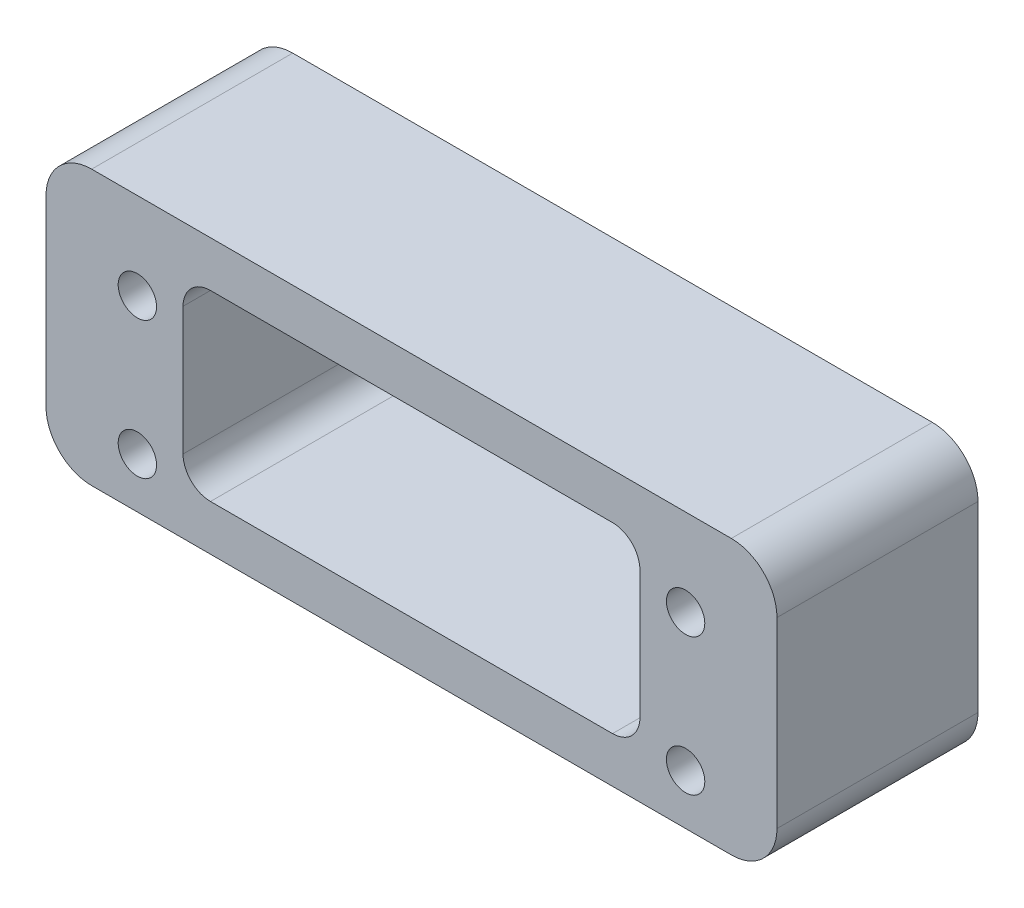
ISO-10303-21;
HEADER;
FILE_DESCRIPTION(('STEP AP214'),'2;1');
FILE_NAME('part.step','',(''),(''),'','','');
FILE_SCHEMA(('AUTOMOTIVE_DESIGN { 1 0 10303 214 1 1 1 1 }'));
ENDSEC;
DATA;
#1=APPLICATION_CONTEXT('core data for automotive mechanical design processes');
#2=APPLICATION_PROTOCOL_DEFINITION('international standard','automotive_design',2000,#1);
#3=PRODUCT_CONTEXT('',#1,'mechanical');
#4=PRODUCT('Part','Part','',(#3));
#5=PRODUCT_RELATED_PRODUCT_CATEGORY('part','',(#4));
#6=PRODUCT_DEFINITION_FORMATION('','',#4);
#7=PRODUCT_DEFINITION_CONTEXT('part definition',#1,'design');
#8=PRODUCT_DEFINITION('design','',#6,#7);
#9=PRODUCT_DEFINITION_SHAPE('','',#8);
#10=(LENGTH_UNIT() NAMED_UNIT(*) SI_UNIT(.MILLI.,.METRE.));
#11=(NAMED_UNIT(*) PLANE_ANGLE_UNIT() SI_UNIT($,.RADIAN.));
#12=(NAMED_UNIT(*) SI_UNIT($,.STERADIAN.) SOLID_ANGLE_UNIT());
#13=UNCERTAINTY_MEASURE_WITH_UNIT(LENGTH_MEASURE(1.E-05),#10,'distance_accuracy_value','');
#14=(GEOMETRIC_REPRESENTATION_CONTEXT(3) GLOBAL_UNCERTAINTY_ASSIGNED_CONTEXT((#13)) GLOBAL_UNIT_ASSIGNED_CONTEXT((#10,
#11,#12)) REPRESENTATION_CONTEXT('',''));
#15=CARTESIAN_POINT('',(0.,0.,0.));
#16=DIRECTION('',(0.,0.,1.));
#17=DIRECTION('',(1.,0.,0.));
#18=AXIS2_PLACEMENT_3D('',#15,#16,#17);
#19=CARTESIAN_POINT('',(40.,15.,11.));
#20=DIRECTION('',(-1.,0.,0.));
#21=DIRECTION('',(0.,-1.,0.));
#22=AXIS2_PLACEMENT_3D('',#19,#20,#21);
#23=PLANE('',#22);
#24=DIRECTION('',(0.,1.,0.));
#25=VECTOR('',#24,1.);
#26=CARTESIAN_POINT('',(40.,15.,11.));
#27=LINE('',#26,#25);
#28=CARTESIAN_POINT('',(40.,-10.,11.));
#29=VERTEX_POINT('',#28);
#30=CARTESIAN_POINT('',(40.,9.99999999999999,11.));
#31=VERTEX_POINT('',#30);
#32=EDGE_CURVE('E168',#29,#31,#27,.T.);
#33=ORIENTED_EDGE('',*,*,#32,.F.);
#34=DIRECTION('',(0.,0.,-1.));
#35=VECTOR('',#34,1.);
#36=CARTESIAN_POINT('',(40.,-10.,11.));
#37=LINE('',#36,#35);
#38=CARTESIAN_POINT('',(40.,-10.,-11.));
#39=VERTEX_POINT('',#38);
#40=EDGE_CURVE('E153',#29,#39,#37,.T.);
#41=ORIENTED_EDGE('',*,*,#40,.T.);
#42=DIRECTION('',(0.,1.,0.));
#43=VECTOR('',#42,1.);
#44=CARTESIAN_POINT('',(40.,15.,-11.));
#45=LINE('',#44,#43);
#46=CARTESIAN_POINT('',(40.,9.99999999999999,-11.));
#47=VERTEX_POINT('',#46);
#48=EDGE_CURVE('E165',#39,#47,#45,.T.);
#49=ORIENTED_EDGE('',*,*,#48,.T.);
#50=DIRECTION('',(0.,0.,-1.));
#51=VECTOR('',#50,1.);
#52=CARTESIAN_POINT('',(40.,9.99999999999999,11.));
#53=LINE('',#52,#51);
#54=EDGE_CURVE('E170',#47,#31,#53,.F.);
#55=ORIENTED_EDGE('',*,*,#54,.T.);
#56=EDGE_LOOP('',(#33,#41,#49,#55));
#57=FACE_BOUND('',#56,.T.);
#58=ADVANCED_FACE('F36',(#57),#23,.F.);
#59=CARTESIAN_POINT('',(-40.,15.,11.));
#60=DIRECTION('',(0.,-1.,0.));
#61=DIRECTION('',(1.,0.,0.));
#62=AXIS2_PLACEMENT_3D('',#59,#60,#61);
#63=PLANE('',#62);
#64=DIRECTION('',(-1.,0.,0.));
#65=VECTOR('',#64,1.);
#66=CARTESIAN_POINT('',(-40.,15.,-11.));
#67=LINE('',#66,#65);
#68=CARTESIAN_POINT('',(35.,15.,-11.));
#69=VERTEX_POINT('',#68);
#70=CARTESIAN_POINT('',(-35.,15.,-11.));
#71=VERTEX_POINT('',#70);
#72=EDGE_CURVE('E174',#69,#71,#67,.T.);
#73=ORIENTED_EDGE('',*,*,#72,.T.);
#74=DIRECTION('',(0.,0.,-1.));
#75=VECTOR('',#74,1.);
#76=CARTESIAN_POINT('',(-35.,15.,11.));
#77=LINE('',#76,#75);
#78=CARTESIAN_POINT('',(-35.,15.,11.));
#79=VERTEX_POINT('',#78);
#80=EDGE_CURVE('E215',#71,#79,#77,.F.);
#81=ORIENTED_EDGE('',*,*,#80,.T.);
#82=DIRECTION('',(-1.,0.,0.));
#83=VECTOR('',#82,1.);
#84=CARTESIAN_POINT('',(-40.,15.,11.));
#85=LINE('',#84,#83);
#86=CARTESIAN_POINT('',(35.,15.,11.));
#87=VERTEX_POINT('',#86);
#88=EDGE_CURVE('E290',#87,#79,#85,.T.);
#89=ORIENTED_EDGE('',*,*,#88,.F.);
#90=DIRECTION('',(0.,0.,-1.));
#91=VECTOR('',#90,1.);
#92=CARTESIAN_POINT('',(35.,15.,11.));
#93=LINE('',#92,#91);
#94=EDGE_CURVE('E212',#87,#69,#93,.T.);
#95=ORIENTED_EDGE('',*,*,#94,.T.);
#96=EDGE_LOOP('',(#73,#81,#89,#95));
#97=FACE_BOUND('',#96,.T.);
#98=ADVANCED_FACE('F314',(#97),#63,.F.);
#99=CARTESIAN_POINT('',(-40.,15.,11.));
#100=DIRECTION('',(1.,0.,0.));
#101=DIRECTION('',(0.,1.,0.));
#102=AXIS2_PLACEMENT_3D('',#99,#100,#101);
#103=PLANE('',#102);
#104=DIRECTION('',(0.,-1.,0.));
#105=VECTOR('',#104,1.);
#106=CARTESIAN_POINT('',(-40.,15.,-11.));
#107=LINE('',#106,#105);
#108=CARTESIAN_POINT('',(-40.,9.99999999999999,-11.));
#109=VERTEX_POINT('',#108);
#110=CARTESIAN_POINT('',(-40.,-10.,-11.));
#111=VERTEX_POINT('',#110);
#112=EDGE_CURVE('E178',#109,#111,#107,.T.);
#113=ORIENTED_EDGE('',*,*,#112,.T.);
#114=DIRECTION('',(0.,0.,-1.));
#115=VECTOR('',#114,1.);
#116=CARTESIAN_POINT('',(-40.,-10.,11.));
#117=LINE('',#116,#115);
#118=CARTESIAN_POINT('',(-40.,-10.,11.));
#119=VERTEX_POINT('',#118);
#120=EDGE_CURVE('E210',#111,#119,#117,.F.);
#121=ORIENTED_EDGE('',*,*,#120,.T.);
#122=DIRECTION('',(0.,-1.,0.));
#123=VECTOR('',#122,1.);
#124=CARTESIAN_POINT('',(-40.,15.,11.));
#125=LINE('',#124,#123);
#126=CARTESIAN_POINT('',(-40.,9.99999999999999,11.));
#127=VERTEX_POINT('',#126);
#128=EDGE_CURVE('E292',#127,#119,#125,.T.);
#129=ORIENTED_EDGE('',*,*,#128,.F.);
#130=DIRECTION('',(0.,0.,-1.));
#131=VECTOR('',#130,1.);
#132=CARTESIAN_POINT('',(-40.,9.99999999999999,11.));
#133=LINE('',#132,#131);
#134=EDGE_CURVE('E207',#127,#109,#133,.T.);
#135=ORIENTED_EDGE('',*,*,#134,.T.);
#136=EDGE_LOOP('',(#113,#121,#129,#135));
#137=FACE_BOUND('',#136,.T.);
#138=ADVANCED_FACE('F307',(#137),#103,.F.);
#139=CARTESIAN_POINT('',(-40.,-15.,11.));
#140=DIRECTION('',(0.,1.,0.));
#141=DIRECTION('',(0.,0.,1.));
#142=AXIS2_PLACEMENT_3D('',#139,#140,#141);
#143=PLANE('',#142);
#144=DIRECTION('',(1.,0.,0.));
#145=VECTOR('',#144,1.);
#146=CARTESIAN_POINT('',(-40.,-15.,-11.));
#147=LINE('',#146,#145);
#148=CARTESIAN_POINT('',(-35.,-15.,-11.));
#149=VERTEX_POINT('',#148);
#150=CARTESIAN_POINT('',(35.,-15.,-11.));
#151=VERTEX_POINT('',#150);
#152=EDGE_CURVE('E189',#149,#151,#147,.T.);
#153=ORIENTED_EDGE('',*,*,#152,.T.);
#154=DIRECTION('',(0.,0.,-1.));
#155=VECTOR('',#154,1.);
#156=CARTESIAN_POINT('',(35.,-15.,11.));
#157=LINE('',#156,#155);
#158=CARTESIAN_POINT('',(35.,-15.,11.));
#159=VERTEX_POINT('',#158);
#160=EDGE_CURVE('E154',#151,#159,#157,.F.);
#161=ORIENTED_EDGE('',*,*,#160,.T.);
#162=DIRECTION('',(1.,0.,0.));
#163=VECTOR('',#162,1.);
#164=CARTESIAN_POINT('',(-40.,-15.,11.));
#165=LINE('',#164,#163);
#166=CARTESIAN_POINT('',(-35.,-15.,11.));
#167=VERTEX_POINT('',#166);
#168=EDGE_CURVE('E184',#167,#159,#165,.T.);
#169=ORIENTED_EDGE('',*,*,#168,.F.);
#170=DIRECTION('',(0.,0.,-1.));
#171=VECTOR('',#170,1.);
#172=CARTESIAN_POINT('',(-35.,-15.,11.));
#173=LINE('',#172,#171);
#174=EDGE_CURVE('E159',#167,#149,#173,.T.);
#175=ORIENTED_EDGE('',*,*,#174,.T.);
#176=EDGE_LOOP('',(#153,#161,#169,#175));
#177=FACE_BOUND('',#176,.T.);
#178=ADVANCED_FACE('F301',(#177),#143,.F.);
#179=CARTESIAN_POINT('',(0.,0.,11.));
#180=DIRECTION('',(0.,0.,1.));
#181=DIRECTION('',(1.,0.,0.));
#182=AXIS2_PLACEMENT_3D('',#179,#180,#181);
#183=PLANE('',#182);
#184=DIRECTION('',(0.,1.,0.));
#185=VECTOR('',#184,1.);
#186=CARTESIAN_POINT('',(25.,10.,11.));
#187=LINE('',#186,#185);
#188=CARTESIAN_POINT('',(25.,-6.99999999999999,11.));
#189=VERTEX_POINT('',#188);
#190=CARTESIAN_POINT('',(25.,7.,11.));
#191=VERTEX_POINT('',#190);
#192=EDGE_CURVE('E254',#189,#191,#187,.T.);
#193=ORIENTED_EDGE('',*,*,#192,.F.);
#194=CARTESIAN_POINT('',(22.,-7.,11.));
#195=DIRECTION('',(0.,0.,1.));
#196=DIRECTION('',(1.,0.,0.));
#197=AXIS2_PLACEMENT_3D('',#194,#195,#196);
#198=CIRCLE('',#197,3.);
#199=CARTESIAN_POINT('',(22.,-10.,11.));
#200=VERTEX_POINT('',#199);
#201=EDGE_CURVE('E44',#189,#200,#198,.F.);
#202=ORIENTED_EDGE('',*,*,#201,.T.);
#203=DIRECTION('',(1.,0.,0.));
#204=VECTOR('',#203,1.);
#205=CARTESIAN_POINT('',(-25.,-10.,11.));
#206=LINE('',#205,#204);
#207=CARTESIAN_POINT('',(-22.,-10.,11.));
#208=VERTEX_POINT('',#207);
#209=EDGE_CURVE('E253',#208,#200,#206,.T.);
#210=ORIENTED_EDGE('',*,*,#209,.F.);
#211=CARTESIAN_POINT('',(-22.,-7.,11.));
#212=DIRECTION('',(0.,0.,1.));
#213=DIRECTION('',(1.,0.,0.));
#214=AXIS2_PLACEMENT_3D('',#211,#212,#213);
#215=CIRCLE('',#214,3.);
#216=CARTESIAN_POINT('',(-25.,-7.,11.));
#217=VERTEX_POINT('',#216);
#218=EDGE_CURVE('E236',#208,#217,#215,.F.);
#219=ORIENTED_EDGE('',*,*,#218,.T.);
#220=DIRECTION('',(0.,-1.,0.));
#221=VECTOR('',#220,1.);
#222=CARTESIAN_POINT('',(-25.,10.,11.));
#223=LINE('',#222,#221);
#224=CARTESIAN_POINT('',(-25.,7.,11.));
#225=VERTEX_POINT('',#224);
#226=EDGE_CURVE('E263',#225,#217,#223,.T.);
#227=ORIENTED_EDGE('',*,*,#226,.F.);
#228=CARTESIAN_POINT('',(-22.,7.,11.));
#229=DIRECTION('',(0.,0.,1.));
#230=DIRECTION('',(1.,0.,0.));
#231=AXIS2_PLACEMENT_3D('',#228,#229,#230);
#232=CIRCLE('',#231,3.);
#233=CARTESIAN_POINT('',(-22.,10.,11.));
#234=VERTEX_POINT('',#233);
#235=EDGE_CURVE('E240',#225,#234,#232,.F.);
#236=ORIENTED_EDGE('',*,*,#235,.T.);
#237=DIRECTION('',(-1.,0.,0.));
#238=VECTOR('',#237,1.);
#239=CARTESIAN_POINT('',(-25.,10.,11.));
#240=LINE('',#239,#238);
#241=CARTESIAN_POINT('',(22.,10.,11.));
#242=VERTEX_POINT('',#241);
#243=EDGE_CURVE('E281',#242,#234,#240,.T.);
#244=ORIENTED_EDGE('',*,*,#243,.F.);
#245=CARTESIAN_POINT('',(22.,7.,11.));
#246=DIRECTION('',(0.,0.,1.));
#247=DIRECTION('',(1.,0.,0.));
#248=AXIS2_PLACEMENT_3D('',#245,#246,#247);
#249=CIRCLE('',#248,3.);
#250=EDGE_CURVE('E244',#242,#191,#249,.F.);
#251=ORIENTED_EDGE('',*,*,#250,.T.);
#252=EDGE_LOOP('',(#193,#202,#210,#219,#227,#236,#244,#251));
#253=FACE_BOUND('',#252,.T.);
#254=CARTESIAN_POINT('',(-30.,-9.49999999999967,11.));
#255=DIRECTION('',(0.,0.,1.));
#256=DIRECTION('',(1.,0.,0.));
#257=AXIS2_PLACEMENT_3D('',#254,#255,#256);
#258=CIRCLE('',#257,2.1);
#259=CARTESIAN_POINT('',(-27.9,-9.49999999999967,11.));
#260=VERTEX_POINT('',#259);
#261=EDGE_CURVE('E273',#260,#260,#258,.T.);
#262=ORIENTED_EDGE('',*,*,#261,.F.);
#263=EDGE_LOOP('',(#262));
#264=FACE_BOUND('',#263,.T.);
#265=CARTESIAN_POINT('',(30.,-9.49999999999967,11.));
#266=DIRECTION('',(0.,0.,1.));
#267=DIRECTION('',(1.,0.,0.));
#268=AXIS2_PLACEMENT_3D('',#265,#266,#267);
#269=CIRCLE('',#268,2.1);
#270=CARTESIAN_POINT('',(32.1,-9.49999999999967,11.));
#271=VERTEX_POINT('',#270);
#272=EDGE_CURVE('E516',#271,#271,#269,.T.);
#273=ORIENTED_EDGE('',*,*,#272,.F.);
#274=EDGE_LOOP('',(#273));
#275=FACE_BOUND('',#274,.T.);
#276=CARTESIAN_POINT('',(30.,5.50000000000033,11.));
#277=DIRECTION('',(0.,0.,1.));
#278=DIRECTION('',(1.,0.,0.));
#279=AXIS2_PLACEMENT_3D('',#276,#277,#278);
#280=CIRCLE('',#279,2.1);
#281=CARTESIAN_POINT('',(32.1,5.50000000000033,11.));
#282=VERTEX_POINT('',#281);
#283=EDGE_CURVE('E510',#282,#282,#280,.T.);
#284=ORIENTED_EDGE('',*,*,#283,.F.);
#285=EDGE_LOOP('',(#284));
#286=FACE_BOUND('',#285,.T.);
#287=CARTESIAN_POINT('',(-30.,5.50000000000033,11.));
#288=DIRECTION('',(0.,0.,1.));
#289=DIRECTION('',(1.,0.,0.));
#290=AXIS2_PLACEMENT_3D('',#287,#288,#289);
#291=CIRCLE('',#290,2.1);
#292=CARTESIAN_POINT('',(-27.9,5.50000000000033,11.));
#293=VERTEX_POINT('',#292);
#294=EDGE_CURVE('E181',#293,#293,#291,.T.);
#295=ORIENTED_EDGE('',*,*,#294,.F.);
#296=EDGE_LOOP('',(#295));
#297=FACE_BOUND('',#296,.T.);
#298=ORIENTED_EDGE('',*,*,#168,.T.);
#299=CARTESIAN_POINT('',(35.,-10.,11.));
#300=DIRECTION('',(0.,0.,1.));
#301=DIRECTION('',(1.,0.,0.));
#302=AXIS2_PLACEMENT_3D('',#299,#300,#301);
#303=CIRCLE('',#302,5.);
#304=EDGE_CURVE('E205',#159,#29,#303,.T.);
#305=ORIENTED_EDGE('',*,*,#304,.T.);
#306=ORIENTED_EDGE('',*,*,#32,.T.);
#307=CARTESIAN_POINT('',(35.,9.99999999999999,11.));
#308=DIRECTION('',(0.,0.,1.));
#309=DIRECTION('',(1.,0.,0.));
#310=AXIS2_PLACEMENT_3D('',#307,#308,#309);
#311=CIRCLE('',#310,5.);
#312=EDGE_CURVE('E199',#31,#87,#311,.T.);
#313=ORIENTED_EDGE('',*,*,#312,.T.);
#314=ORIENTED_EDGE('',*,*,#88,.T.);
#315=CARTESIAN_POINT('',(-35.,9.99999999999999,11.));
#316=DIRECTION('',(0.,0.,1.));
#317=DIRECTION('',(1.,0.,0.));
#318=AXIS2_PLACEMENT_3D('',#315,#316,#317);
#319=CIRCLE('',#318,5.);
#320=EDGE_CURVE('E201',#79,#127,#319,.T.);
#321=ORIENTED_EDGE('',*,*,#320,.T.);
#322=ORIENTED_EDGE('',*,*,#128,.T.);
#323=CARTESIAN_POINT('',(-35.,-10.,11.));
#324=DIRECTION('',(0.,0.,1.));
#325=DIRECTION('',(1.,0.,0.));
#326=AXIS2_PLACEMENT_3D('',#323,#324,#325);
#327=CIRCLE('',#326,5.);
#328=EDGE_CURVE('E203',#119,#167,#327,.T.);
#329=ORIENTED_EDGE('',*,*,#328,.T.);
#330=EDGE_LOOP('',(#298,#305,#306,#313,#314,#321,#322,#329));
#331=FACE_BOUND('',#330,.T.);
#332=ADVANCED_FACE('F251',(#253,#264,#275,#286,#297,#331),#183,.T.);
#333=CARTESIAN_POINT('',(0.,0.,-11.));
#334=DIRECTION('',(0.,0.,1.));
#335=DIRECTION('',(1.,0.,0.));
#336=AXIS2_PLACEMENT_3D('',#333,#334,#335);
#337=PLANE('',#336);
#338=DIRECTION('',(0.,-1.,0.));
#339=VECTOR('',#338,1.);
#340=CARTESIAN_POINT('',(-25.,10.,-11.));
#341=LINE('',#340,#339);
#342=CARTESIAN_POINT('',(-25.,7.,-11.));
#343=VERTEX_POINT('',#342);
#344=CARTESIAN_POINT('',(-25.,-7.,-11.));
#345=VERTEX_POINT('',#344);
#346=EDGE_CURVE('E270',#343,#345,#341,.T.);
#347=ORIENTED_EDGE('',*,*,#346,.T.);
#348=CARTESIAN_POINT('',(-22.,-7.,-11.));
#349=DIRECTION('',(0.,0.,1.));
#350=DIRECTION('',(1.,0.,0.));
#351=AXIS2_PLACEMENT_3D('',#348,#349,#350);
#352=CIRCLE('',#351,3.);
#353=CARTESIAN_POINT('',(-22.,-10.,-11.));
#354=VERTEX_POINT('',#353);
#355=EDGE_CURVE('E238',#345,#354,#352,.T.);
#356=ORIENTED_EDGE('',*,*,#355,.T.);
#357=DIRECTION('',(1.,0.,0.));
#358=VECTOR('',#357,1.);
#359=CARTESIAN_POINT('',(-25.,-10.,-11.));
#360=LINE('',#359,#358);
#361=CARTESIAN_POINT('',(22.,-10.,-11.));
#362=VERTEX_POINT('',#361);
#363=EDGE_CURVE('E278',#354,#362,#360,.T.);
#364=ORIENTED_EDGE('',*,*,#363,.T.);
#365=CARTESIAN_POINT('',(22.,-7.,-11.));
#366=DIRECTION('',(0.,0.,1.));
#367=DIRECTION('',(1.,0.,0.));
#368=AXIS2_PLACEMENT_3D('',#365,#366,#367);
#369=CIRCLE('',#368,3.);
#370=CARTESIAN_POINT('',(25.,-6.99999999999999,-11.));
#371=VERTEX_POINT('',#370);
#372=EDGE_CURVE('E11',#362,#371,#369,.T.);
#373=ORIENTED_EDGE('',*,*,#372,.T.);
#374=DIRECTION('',(0.,1.,0.));
#375=VECTOR('',#374,1.);
#376=CARTESIAN_POINT('',(25.,10.,-11.));
#377=LINE('',#376,#375);
#378=CARTESIAN_POINT('',(25.,7.,-11.));
#379=VERTEX_POINT('',#378);
#380=EDGE_CURVE('E262',#371,#379,#377,.T.);
#381=ORIENTED_EDGE('',*,*,#380,.T.);
#382=CARTESIAN_POINT('',(22.,7.,-11.));
#383=DIRECTION('',(0.,0.,1.));
#384=DIRECTION('',(1.,0.,0.));
#385=AXIS2_PLACEMENT_3D('',#382,#383,#384);
#386=CIRCLE('',#385,3.);
#387=CARTESIAN_POINT('',(22.,10.,-11.));
#388=VERTEX_POINT('',#387);
#389=EDGE_CURVE('E246',#379,#388,#386,.T.);
#390=ORIENTED_EDGE('',*,*,#389,.T.);
#391=DIRECTION('',(-1.,0.,0.));
#392=VECTOR('',#391,1.);
#393=CARTESIAN_POINT('',(-25.,10.,-11.));
#394=LINE('',#393,#392);
#395=CARTESIAN_POINT('',(-22.,10.,-11.));
#396=VERTEX_POINT('',#395);
#397=EDGE_CURVE('E267',#388,#396,#394,.T.);
#398=ORIENTED_EDGE('',*,*,#397,.T.);
#399=CARTESIAN_POINT('',(-22.,7.,-11.));
#400=DIRECTION('',(0.,0.,1.));
#401=DIRECTION('',(1.,0.,0.));
#402=AXIS2_PLACEMENT_3D('',#399,#400,#401);
#403=CIRCLE('',#402,3.);
#404=EDGE_CURVE('E242',#396,#343,#403,.T.);
#405=ORIENTED_EDGE('',*,*,#404,.T.);
#406=EDGE_LOOP('',(#347,#356,#364,#373,#381,#390,#398,#405));
#407=FACE_BOUND('',#406,.T.);
#408=CARTESIAN_POINT('',(-30.,-9.49999999999967,-11.));
#409=DIRECTION('',(0.,0.,1.));
#410=DIRECTION('',(1.,0.,0.));
#411=AXIS2_PLACEMENT_3D('',#408,#409,#410);
#412=CIRCLE('',#411,2.1);
#413=CARTESIAN_POINT('',(-27.9,-9.49999999999967,-11.));
#414=VERTEX_POINT('',#413);
#415=EDGE_CURVE('E498',#414,#414,#412,.T.);
#416=ORIENTED_EDGE('',*,*,#415,.T.);
#417=EDGE_LOOP('',(#416));
#418=FACE_BOUND('',#417,.T.);
#419=CARTESIAN_POINT('',(30.,-9.49999999999967,-11.));
#420=DIRECTION('',(0.,0.,1.));
#421=DIRECTION('',(1.,0.,0.));
#422=AXIS2_PLACEMENT_3D('',#419,#420,#421);
#423=CIRCLE('',#422,2.1);
#424=CARTESIAN_POINT('',(32.1,-9.49999999999967,-11.));
#425=VERTEX_POINT('',#424);
#426=EDGE_CURVE('E502',#425,#425,#423,.T.);
#427=ORIENTED_EDGE('',*,*,#426,.T.);
#428=EDGE_LOOP('',(#427));
#429=FACE_BOUND('',#428,.T.);
#430=CARTESIAN_POINT('',(30.,5.50000000000033,-11.));
#431=DIRECTION('',(0.,0.,1.));
#432=DIRECTION('',(1.,0.,0.));
#433=AXIS2_PLACEMENT_3D('',#430,#431,#432);
#434=CIRCLE('',#433,2.1);
#435=CARTESIAN_POINT('',(32.1,5.50000000000033,-11.));
#436=VERTEX_POINT('',#435);
#437=EDGE_CURVE('E288',#436,#436,#434,.T.);
#438=ORIENTED_EDGE('',*,*,#437,.T.);
#439=EDGE_LOOP('',(#438));
#440=FACE_BOUND('',#439,.T.);
#441=CARTESIAN_POINT('',(-30.,5.50000000000033,-11.));
#442=DIRECTION('',(0.,0.,1.));
#443=DIRECTION('',(1.,0.,0.));
#444=AXIS2_PLACEMENT_3D('',#441,#442,#443);
#445=CIRCLE('',#444,2.1);
#446=CARTESIAN_POINT('',(-27.9,5.50000000000033,-11.));
#447=VERTEX_POINT('',#446);
#448=EDGE_CURVE('E175',#447,#447,#445,.T.);
#449=ORIENTED_EDGE('',*,*,#448,.T.);
#450=EDGE_LOOP('',(#449));
#451=FACE_BOUND('',#450,.T.);
#452=ORIENTED_EDGE('',*,*,#48,.F.);
#453=CARTESIAN_POINT('',(35.,-10.,-11.));
#454=DIRECTION('',(0.,0.,1.));
#455=DIRECTION('',(1.,0.,0.));
#456=AXIS2_PLACEMENT_3D('',#453,#454,#455);
#457=CIRCLE('',#456,5.);
#458=EDGE_CURVE('E149',#39,#151,#457,.F.);
#459=ORIENTED_EDGE('',*,*,#458,.T.);
#460=ORIENTED_EDGE('',*,*,#152,.F.);
#461=CARTESIAN_POINT('',(-35.,-10.,-11.));
#462=DIRECTION('',(0.,0.,1.));
#463=DIRECTION('',(1.,0.,0.));
#464=AXIS2_PLACEMENT_3D('',#461,#462,#463);
#465=CIRCLE('',#464,5.);
#466=EDGE_CURVE('E160',#149,#111,#465,.F.);
#467=ORIENTED_EDGE('',*,*,#466,.T.);
#468=ORIENTED_EDGE('',*,*,#112,.F.);
#469=CARTESIAN_POINT('',(-35.,9.99999999999999,-11.));
#470=DIRECTION('',(0.,0.,1.));
#471=DIRECTION('',(1.,0.,0.));
#472=AXIS2_PLACEMENT_3D('',#469,#470,#471);
#473=CIRCLE('',#472,5.);
#474=EDGE_CURVE('E193',#109,#71,#473,.F.);
#475=ORIENTED_EDGE('',*,*,#474,.T.);
#476=ORIENTED_EDGE('',*,*,#72,.F.);
#477=CARTESIAN_POINT('',(35.,9.99999999999999,-11.));
#478=DIRECTION('',(0.,0.,1.));
#479=DIRECTION('',(1.,0.,0.));
#480=AXIS2_PLACEMENT_3D('',#477,#478,#479);
#481=CIRCLE('',#480,5.);
#482=EDGE_CURVE('E169',#69,#47,#481,.F.);
#483=ORIENTED_EDGE('',*,*,#482,.T.);
#484=EDGE_LOOP('',(#452,#459,#460,#467,#468,#475,#476,#483));
#485=FACE_BOUND('',#484,.T.);
#486=ADVANCED_FACE('F172',(#407,#418,#429,#440,#451,#485),#337,.F.);
#487=CARTESIAN_POINT('',(35.,-10.,11.));
#488=DIRECTION('',(0.,0.,-1.));
#489=DIRECTION('',(-1.,0.,0.));
#490=AXIS2_PLACEMENT_3D('',#487,#488,#489);
#491=CYLINDRICAL_SURFACE('',#490,5.);
#492=ORIENTED_EDGE('',*,*,#304,.F.);
#493=ORIENTED_EDGE('',*,*,#160,.F.);
#494=ORIENTED_EDGE('',*,*,#458,.F.);
#495=ORIENTED_EDGE('',*,*,#40,.F.);
#496=EDGE_LOOP('',(#492,#493,#494,#495));
#497=FACE_BOUND('',#496,.T.);
#498=ADVANCED_FACE('F152',(#497),#491,.T.);
#499=CARTESIAN_POINT('',(-35.,-10.,11.));
#500=DIRECTION('',(0.,0.,-1.));
#501=DIRECTION('',(-1.,0.,0.));
#502=AXIS2_PLACEMENT_3D('',#499,#500,#501);
#503=CYLINDRICAL_SURFACE('',#502,5.);
#504=ORIENTED_EDGE('',*,*,#328,.F.);
#505=ORIENTED_EDGE('',*,*,#120,.F.);
#506=ORIENTED_EDGE('',*,*,#466,.F.);
#507=ORIENTED_EDGE('',*,*,#174,.F.);
#508=EDGE_LOOP('',(#504,#505,#506,#507));
#509=FACE_BOUND('',#508,.T.);
#510=ADVANCED_FACE('F303',(#509),#503,.T.);
#511=CARTESIAN_POINT('',(-35.,9.99999999999999,11.));
#512=DIRECTION('',(0.,0.,-1.));
#513=DIRECTION('',(-1.,0.,0.));
#514=AXIS2_PLACEMENT_3D('',#511,#512,#513);
#515=CYLINDRICAL_SURFACE('',#514,5.);
#516=ORIENTED_EDGE('',*,*,#320,.F.);
#517=ORIENTED_EDGE('',*,*,#80,.F.);
#518=ORIENTED_EDGE('',*,*,#474,.F.);
#519=ORIENTED_EDGE('',*,*,#134,.F.);
#520=EDGE_LOOP('',(#516,#517,#518,#519));
#521=FACE_BOUND('',#520,.T.);
#522=ADVANCED_FACE('F311',(#521),#515,.T.);
#523=CARTESIAN_POINT('',(35.,9.99999999999999,11.));
#524=DIRECTION('',(0.,0.,-1.));
#525=DIRECTION('',(-1.,0.,0.));
#526=AXIS2_PLACEMENT_3D('',#523,#524,#525);
#527=CYLINDRICAL_SURFACE('',#526,5.);
#528=ORIENTED_EDGE('',*,*,#312,.F.);
#529=ORIENTED_EDGE('',*,*,#54,.F.);
#530=ORIENTED_EDGE('',*,*,#482,.F.);
#531=ORIENTED_EDGE('',*,*,#94,.F.);
#532=EDGE_LOOP('',(#528,#529,#530,#531));
#533=FACE_BOUND('',#532,.T.);
#534=ADVANCED_FACE('F319',(#533),#527,.T.);
#535=CARTESIAN_POINT('',(-30.,5.50000000000033,-11.));
#536=DIRECTION('',(0.,0.,1.));
#537=DIRECTION('',(1.,0.,0.));
#538=AXIS2_PLACEMENT_3D('',#535,#536,#537);
#539=CYLINDRICAL_SURFACE('',#538,2.1);
#540=ORIENTED_EDGE('',*,*,#448,.F.);
#541=EDGE_LOOP('',(#540));
#542=FACE_BOUND('',#541,.T.);
#543=ORIENTED_EDGE('',*,*,#294,.T.);
#544=EDGE_LOOP('',(#543));
#545=FACE_BOUND('',#544,.T.);
#546=ADVANCED_FACE('F321',(#542,#545),#539,.F.);
#547=CARTESIAN_POINT('',(30.,5.50000000000033,-11.));
#548=DIRECTION('',(0.,0.,1.));
#549=DIRECTION('',(1.,0.,0.));
#550=AXIS2_PLACEMENT_3D('',#547,#548,#549);
#551=CYLINDRICAL_SURFACE('',#550,2.1);
#552=ORIENTED_EDGE('',*,*,#437,.F.);
#553=EDGE_LOOP('',(#552));
#554=FACE_BOUND('',#553,.T.);
#555=ORIENTED_EDGE('',*,*,#283,.T.);
#556=EDGE_LOOP('',(#555));
#557=FACE_BOUND('',#556,.T.);
#558=ADVANCED_FACE('F327',(#554,#557),#551,.F.);
#559=CARTESIAN_POINT('',(30.,-9.49999999999967,-11.));
#560=DIRECTION('',(0.,0.,1.));
#561=DIRECTION('',(1.,0.,0.));
#562=AXIS2_PLACEMENT_3D('',#559,#560,#561);
#563=CYLINDRICAL_SURFACE('',#562,2.1);
#564=ORIENTED_EDGE('',*,*,#426,.F.);
#565=EDGE_LOOP('',(#564));
#566=FACE_BOUND('',#565,.T.);
#567=ORIENTED_EDGE('',*,*,#272,.T.);
#568=EDGE_LOOP('',(#567));
#569=FACE_BOUND('',#568,.T.);
#570=ADVANCED_FACE('F371',(#566,#569),#563,.F.);
#571=CARTESIAN_POINT('',(-30.,-9.49999999999967,-11.));
#572=DIRECTION('',(0.,0.,1.));
#573=DIRECTION('',(1.,0.,0.));
#574=AXIS2_PLACEMENT_3D('',#571,#572,#573);
#575=CYLINDRICAL_SURFACE('',#574,2.1);
#576=ORIENTED_EDGE('',*,*,#415,.F.);
#577=EDGE_LOOP('',(#576));
#578=FACE_BOUND('',#577,.T.);
#579=ORIENTED_EDGE('',*,*,#261,.T.);
#580=EDGE_LOOP('',(#579));
#581=FACE_BOUND('',#580,.T.);
#582=ADVANCED_FACE('F381',(#578,#581),#575,.F.);
#583=CARTESIAN_POINT('',(25.,10.,-11.));
#584=DIRECTION('',(1.,0.,0.));
#585=DIRECTION('',(0.,1.,0.));
#586=AXIS2_PLACEMENT_3D('',#583,#584,#585);
#587=PLANE('',#586);
#588=ORIENTED_EDGE('',*,*,#192,.T.);
#589=DIRECTION('',(0.,0.,1.));
#590=VECTOR('',#589,1.);
#591=CARTESIAN_POINT('',(25.,7.,-11.));
#592=LINE('',#591,#590);
#593=EDGE_CURVE('E51',#191,#379,#592,.F.);
#594=ORIENTED_EDGE('',*,*,#593,.T.);
#595=ORIENTED_EDGE('',*,*,#380,.F.);
#596=DIRECTION('',(0.,0.,1.));
#597=VECTOR('',#596,1.);
#598=CARTESIAN_POINT('',(25.,-6.99999999999999,11.));
#599=LINE('',#598,#597);
#600=EDGE_CURVE('E232',#371,#189,#599,.T.);
#601=ORIENTED_EDGE('',*,*,#600,.T.);
#602=EDGE_LOOP('',(#588,#594,#595,#601));
#603=FACE_BOUND('',#602,.T.);
#604=ADVANCED_FACE('F265',(#603),#587,.F.);
#605=CARTESIAN_POINT('',(-25.,-10.,-11.));
#606=DIRECTION('',(0.,-1.,0.));
#607=DIRECTION('',(0.,0.,-1.));
#608=AXIS2_PLACEMENT_3D('',#605,#606,#607);
#609=PLANE('',#608);
#610=ORIENTED_EDGE('',*,*,#363,.F.);
#611=DIRECTION('',(0.,0.,1.));
#612=VECTOR('',#611,1.);
#613=CARTESIAN_POINT('',(-22.,-10.,11.));
#614=LINE('',#613,#612);
#615=EDGE_CURVE('E219',#354,#208,#614,.T.);
#616=ORIENTED_EDGE('',*,*,#615,.T.);
#617=ORIENTED_EDGE('',*,*,#209,.T.);
#618=DIRECTION('',(0.,0.,1.));
#619=VECTOR('',#618,1.);
#620=CARTESIAN_POINT('',(22.,-10.,-11.));
#621=LINE('',#620,#619);
#622=EDGE_CURVE('E217',#200,#362,#621,.F.);
#623=ORIENTED_EDGE('',*,*,#622,.T.);
#624=EDGE_LOOP('',(#610,#616,#617,#623));
#625=FACE_BOUND('',#624,.T.);
#626=ADVANCED_FACE('F260',(#625),#609,.F.);
#627=CARTESIAN_POINT('',(-25.,10.,-11.));
#628=DIRECTION('',(-1.,0.,0.));
#629=DIRECTION('',(0.,-1.,0.));
#630=AXIS2_PLACEMENT_3D('',#627,#628,#629);
#631=PLANE('',#630);
#632=ORIENTED_EDGE('',*,*,#226,.T.);
#633=DIRECTION('',(0.,0.,1.));
#634=VECTOR('',#633,1.);
#635=CARTESIAN_POINT('',(-25.,-7.,-11.));
#636=LINE('',#635,#634);
#637=EDGE_CURVE('E225',#217,#345,#636,.F.);
#638=ORIENTED_EDGE('',*,*,#637,.T.);
#639=ORIENTED_EDGE('',*,*,#346,.F.);
#640=DIRECTION('',(0.,0.,1.));
#641=VECTOR('',#640,1.);
#642=CARTESIAN_POINT('',(-25.,7.,11.));
#643=LINE('',#642,#641);
#644=EDGE_CURVE('E222',#343,#225,#643,.T.);
#645=ORIENTED_EDGE('',*,*,#644,.T.);
#646=EDGE_LOOP('',(#632,#638,#639,#645));
#647=FACE_BOUND('',#646,.T.);
#648=ADVANCED_FACE('F426',(#647),#631,.F.);
#649=CARTESIAN_POINT('',(-25.,10.,-11.));
#650=DIRECTION('',(0.,1.,0.));
#651=DIRECTION('',(0.,0.,1.));
#652=AXIS2_PLACEMENT_3D('',#649,#650,#651);
#653=PLANE('',#652);
#654=ORIENTED_EDGE('',*,*,#243,.T.);
#655=DIRECTION('',(0.,0.,1.));
#656=VECTOR('',#655,1.);
#657=CARTESIAN_POINT('',(-22.,10.,-11.));
#658=LINE('',#657,#656);
#659=EDGE_CURVE('E230',#234,#396,#658,.F.);
#660=ORIENTED_EDGE('',*,*,#659,.T.);
#661=ORIENTED_EDGE('',*,*,#397,.F.);
#662=DIRECTION('',(0.,0.,1.));
#663=VECTOR('',#662,1.);
#664=CARTESIAN_POINT('',(22.,10.,11.));
#665=LINE('',#664,#663);
#666=EDGE_CURVE('E227',#388,#242,#665,.T.);
#667=ORIENTED_EDGE('',*,*,#666,.T.);
#668=EDGE_LOOP('',(#654,#660,#661,#667));
#669=FACE_BOUND('',#668,.T.);
#670=ADVANCED_FACE('F435',(#669),#653,.F.);
#671=CARTESIAN_POINT('',(-22.,-7.,-11.));
#672=DIRECTION('',(0.,0.,-1.));
#673=DIRECTION('',(-1.,0.,0.));
#674=AXIS2_PLACEMENT_3D('',#671,#672,#673);
#675=CYLINDRICAL_SURFACE('',#674,3.);
#676=ORIENTED_EDGE('',*,*,#355,.F.);
#677=ORIENTED_EDGE('',*,*,#637,.F.);
#678=ORIENTED_EDGE('',*,*,#218,.F.);
#679=ORIENTED_EDGE('',*,*,#615,.F.);
#680=EDGE_LOOP('',(#676,#677,#678,#679));
#681=FACE_BOUND('',#680,.T.);
#682=ADVANCED_FACE('F445',(#681),#675,.F.);
#683=CARTESIAN_POINT('',(-22.,7.,-11.));
#684=DIRECTION('',(0.,0.,-1.));
#685=DIRECTION('',(-1.,0.,0.));
#686=AXIS2_PLACEMENT_3D('',#683,#684,#685);
#687=CYLINDRICAL_SURFACE('',#686,3.);
#688=ORIENTED_EDGE('',*,*,#404,.F.);
#689=ORIENTED_EDGE('',*,*,#659,.F.);
#690=ORIENTED_EDGE('',*,*,#235,.F.);
#691=ORIENTED_EDGE('',*,*,#644,.F.);
#692=EDGE_LOOP('',(#688,#689,#690,#691));
#693=FACE_BOUND('',#692,.T.);
#694=ADVANCED_FACE('F455',(#693),#687,.F.);
#695=CARTESIAN_POINT('',(22.,7.,-11.));
#696=DIRECTION('',(0.,0.,-1.));
#697=DIRECTION('',(-1.,0.,0.));
#698=AXIS2_PLACEMENT_3D('',#695,#696,#697);
#699=CYLINDRICAL_SURFACE('',#698,3.);
#700=ORIENTED_EDGE('',*,*,#389,.F.);
#701=ORIENTED_EDGE('',*,*,#593,.F.);
#702=ORIENTED_EDGE('',*,*,#250,.F.);
#703=ORIENTED_EDGE('',*,*,#666,.F.);
#704=EDGE_LOOP('',(#700,#701,#702,#703));
#705=FACE_BOUND('',#704,.T.);
#706=ADVANCED_FACE('F464',(#705),#699,.F.);
#707=CARTESIAN_POINT('',(22.,-7.,-11.));
#708=DIRECTION('',(0.,0.,-1.));
#709=DIRECTION('',(-1.,0.,0.));
#710=AXIS2_PLACEMENT_3D('',#707,#708,#709);
#711=CYLINDRICAL_SURFACE('',#710,3.);
#712=ORIENTED_EDGE('',*,*,#372,.F.);
#713=ORIENTED_EDGE('',*,*,#622,.F.);
#714=ORIENTED_EDGE('',*,*,#201,.F.);
#715=ORIENTED_EDGE('',*,*,#600,.F.);
#716=EDGE_LOOP('',(#712,#713,#714,#715));
#717=FACE_BOUND('',#716,.T.);
#718=ADVANCED_FACE('F38',(#717),#711,.F.);
#719=CLOSED_SHELL('',(#58,#98,#138,#178,#332,#486,#498,#510,#522,#534,#546,#558,#570,#582,#604,
#626,#648,#670,#682,#694,#706,#718));
#720=MANIFOLD_SOLID_BREP('B2',#719);
#721=ADVANCED_BREP_SHAPE_REPRESENTATION('',(#18,#720),#14);
#722=SHAPE_DEFINITION_REPRESENTATION(#9,#721);
ENDSEC;
END-ISO-10303-21;
